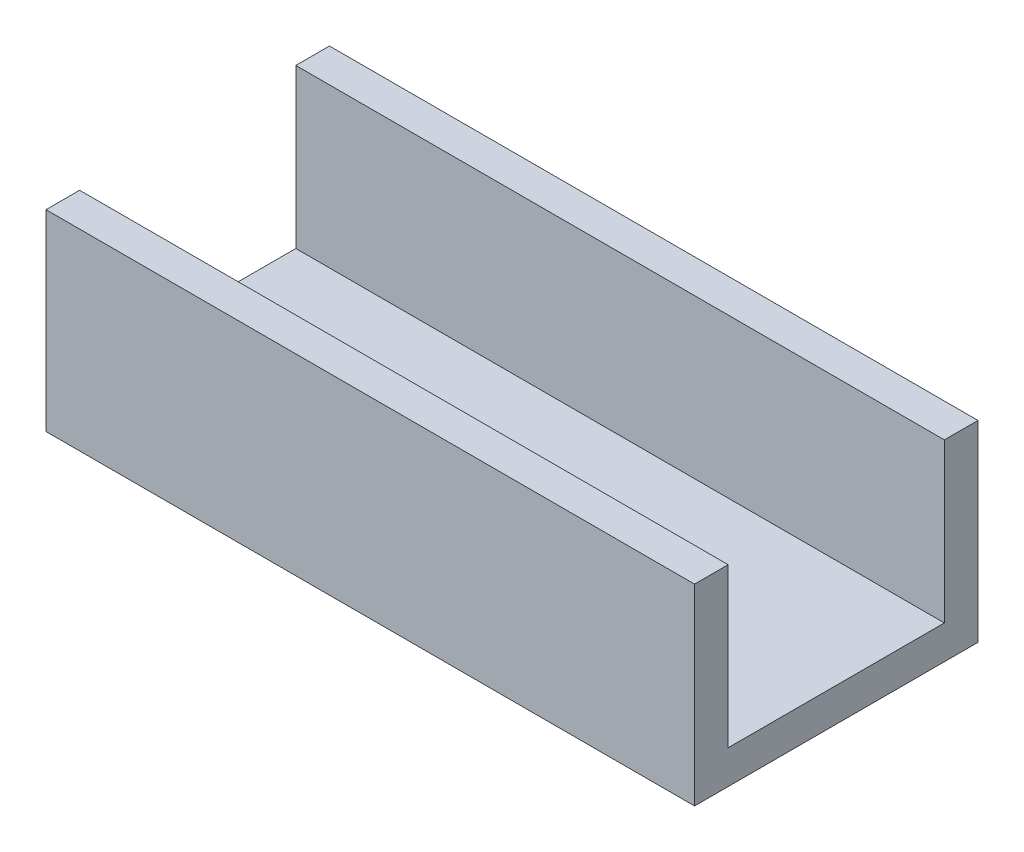
ISO-10303-21;
HEADER;
FILE_DESCRIPTION(('STEP AP214'),'2;1');
FILE_NAME('part.step','',(''),(''),'','','');
FILE_SCHEMA(('AUTOMOTIVE_DESIGN { 1 0 10303 214 1 1 1 1 }'));
ENDSEC;
DATA;
#1=APPLICATION_CONTEXT('core data for automotive mechanical design processes');
#2=APPLICATION_PROTOCOL_DEFINITION('international standard','automotive_design',2000,#1);
#3=PRODUCT_CONTEXT('',#1,'mechanical');
#4=PRODUCT('Part','Part','',(#3));
#5=PRODUCT_RELATED_PRODUCT_CATEGORY('part','',(#4));
#6=PRODUCT_DEFINITION_FORMATION('','',#4);
#7=PRODUCT_DEFINITION_CONTEXT('part definition',#1,'design');
#8=PRODUCT_DEFINITION('design','',#6,#7);
#9=PRODUCT_DEFINITION_SHAPE('','',#8);
#10=(LENGTH_UNIT() NAMED_UNIT(*) SI_UNIT(.MILLI.,.METRE.));
#11=(NAMED_UNIT(*) PLANE_ANGLE_UNIT() SI_UNIT($,.RADIAN.));
#12=(NAMED_UNIT(*) SI_UNIT($,.STERADIAN.) SOLID_ANGLE_UNIT());
#13=UNCERTAINTY_MEASURE_WITH_UNIT(LENGTH_MEASURE(1.E-05),#10,'distance_accuracy_value','');
#14=(GEOMETRIC_REPRESENTATION_CONTEXT(3) GLOBAL_UNCERTAINTY_ASSIGNED_CONTEXT((#13)) GLOBAL_UNIT_ASSIGNED_CONTEXT((#10,
#11,#12)) REPRESENTATION_CONTEXT('',''));
#15=CARTESIAN_POINT('',(0.,0.,0.));
#16=DIRECTION('',(0.,0.,1.));
#17=DIRECTION('',(1.,0.,0.));
#18=AXIS2_PLACEMENT_3D('',#15,#16,#17);
#19=CARTESIAN_POINT('',(0.,1.4,0.));
#20=DIRECTION('',(0.,1.,0.));
#21=DIRECTION('',(0.,0.,1.));
#22=AXIS2_PLACEMENT_3D('',#19,#20,#21);
#23=PLANE('',#22);
#24=DIRECTION('',(0.,0.,-1.));
#25=VECTOR('',#24,1.);
#26=CARTESIAN_POINT('',(0.,1.4,0.));
#27=LINE('',#26,#25);
#28=CARTESIAN_POINT('',(0.,1.4,-1.4));
#29=VERTEX_POINT('',#28);
#30=CARTESIAN_POINT('',(0.,1.4,-10.4));
#31=VERTEX_POINT('',#30);
#32=EDGE_CURVE('E56',#29,#31,#27,.T.);
#33=ORIENTED_EDGE('',*,*,#32,.F.);
#34=DIRECTION('',(1.,0.,0.));
#35=VECTOR('',#34,1.);
#36=CARTESIAN_POINT('',(0.,1.4,-1.4));
#37=LINE('',#36,#35);
#38=CARTESIAN_POINT('',(27.,1.4,-1.4));
#39=VERTEX_POINT('',#38);
#40=EDGE_CURVE('E60',#29,#39,#37,.T.);
#41=ORIENTED_EDGE('',*,*,#40,.T.);
#42=DIRECTION('',(0.,0.,-1.));
#43=VECTOR('',#42,1.);
#44=CARTESIAN_POINT('',(27.,1.4,0.));
#45=LINE('',#44,#43);
#46=CARTESIAN_POINT('',(27.,1.4,-10.4));
#47=VERTEX_POINT('',#46);
#48=EDGE_CURVE('E126',#39,#47,#45,.T.);
#49=ORIENTED_EDGE('',*,*,#48,.T.);
#50=DIRECTION('',(-1.,0.,0.));
#51=VECTOR('',#50,1.);
#52=CARTESIAN_POINT('',(0.,1.4,-10.4));
#53=LINE('',#52,#51);
#54=EDGE_CURVE('E149',#47,#31,#53,.T.);
#55=ORIENTED_EDGE('',*,*,#54,.T.);
#56=EDGE_LOOP('',(#33,#41,#49,#55));
#57=FACE_BOUND('',#56,.T.);
#58=ADVANCED_FACE('F41',(#57),#23,.T.);
#59=CARTESIAN_POINT('',(0.,1.4,0.));
#60=DIRECTION('',(-1.,0.,0.));
#61=DIRECTION('',(0.,0.,1.));
#62=AXIS2_PLACEMENT_3D('',#59,#60,#61);
#63=PLANE('',#62);
#64=DIRECTION('',(0.,-1.,0.));
#65=VECTOR('',#64,1.);
#66=CARTESIAN_POINT('',(0.,1.4,0.));
#67=LINE('',#66,#65);
#68=CARTESIAN_POINT('',(0.,8.,0.));
#69=VERTEX_POINT('',#68);
#70=CARTESIAN_POINT('',(0.,0.,0.));
#71=VERTEX_POINT('',#70);
#72=EDGE_CURVE('E11',#69,#71,#67,.T.);
#73=ORIENTED_EDGE('',*,*,#72,.F.);
#74=DIRECTION('',(0.,0.,-1.));
#75=VECTOR('',#74,1.);
#76=CARTESIAN_POINT('',(0.,8.,0.));
#77=LINE('',#76,#75);
#78=CARTESIAN_POINT('',(0.,8.,-1.4));
#79=VERTEX_POINT('',#78);
#80=EDGE_CURVE('E113',#69,#79,#77,.T.);
#81=ORIENTED_EDGE('',*,*,#80,.T.);
#82=DIRECTION('',(0.,-1.,0.));
#83=VECTOR('',#82,1.);
#84=CARTESIAN_POINT('',(0.,8.,-1.4));
#85=LINE('',#84,#83);
#86=EDGE_CURVE('E109',#79,#29,#85,.T.);
#87=ORIENTED_EDGE('',*,*,#86,.T.);
#88=ORIENTED_EDGE('',*,*,#32,.T.);
#89=DIRECTION('',(0.,-1.,0.));
#90=VECTOR('',#89,1.);
#91=CARTESIAN_POINT('',(0.,8.,-10.4));
#92=LINE('',#91,#90);
#93=CARTESIAN_POINT('',(0.,8.,-10.4));
#94=VERTEX_POINT('',#93);
#95=EDGE_CURVE('E144',#94,#31,#92,.T.);
#96=ORIENTED_EDGE('',*,*,#95,.F.);
#97=DIRECTION('',(0.,0.,-1.));
#98=VECTOR('',#97,1.);
#99=CARTESIAN_POINT('',(0.,8.,0.));
#100=LINE('',#99,#98);
#101=CARTESIAN_POINT('',(0.,8.,-11.8));
#102=VERTEX_POINT('',#101);
#103=EDGE_CURVE('E141',#94,#102,#100,.T.);
#104=ORIENTED_EDGE('',*,*,#103,.T.);
#105=DIRECTION('',(0.,-1.,0.));
#106=VECTOR('',#105,1.);
#107=CARTESIAN_POINT('',(0.,1.4,-11.8));
#108=LINE('',#107,#106);
#109=CARTESIAN_POINT('',(0.,0.,-11.8));
#110=VERTEX_POINT('',#109);
#111=EDGE_CURVE('E155',#102,#110,#108,.T.);
#112=ORIENTED_EDGE('',*,*,#111,.T.);
#113=DIRECTION('',(0.,0.,-1.));
#114=VECTOR('',#113,1.);
#115=CARTESIAN_POINT('',(0.,0.,0.));
#116=LINE('',#115,#114);
#117=EDGE_CURVE('E151',#71,#110,#116,.T.);
#118=ORIENTED_EDGE('',*,*,#117,.F.);
#119=EDGE_LOOP('',(#73,#81,#87,#88,#96,#104,#112,#118));
#120=FACE_BOUND('',#119,.T.);
#121=ADVANCED_FACE('F43',(#120),#63,.T.);
#122=CARTESIAN_POINT('',(0.,1.4,0.));
#123=DIRECTION('',(0.,0.,-1.));
#124=DIRECTION('',(-1.,0.,0.));
#125=AXIS2_PLACEMENT_3D('',#122,#123,#124);
#126=PLANE('',#125);
#127=DIRECTION('',(1.,0.,0.));
#128=VECTOR('',#127,1.);
#129=CARTESIAN_POINT('',(0.,0.,0.));
#130=LINE('',#129,#128);
#131=CARTESIAN_POINT('',(27.,0.,0.));
#132=VERTEX_POINT('',#131);
#133=EDGE_CURVE('E157',#71,#132,#130,.T.);
#134=ORIENTED_EDGE('',*,*,#133,.T.);
#135=DIRECTION('',(0.,-1.,0.));
#136=VECTOR('',#135,1.);
#137=CARTESIAN_POINT('',(27.,1.4,0.));
#138=LINE('',#137,#136);
#139=CARTESIAN_POINT('',(27.,8.,0.));
#140=VERTEX_POINT('',#139);
#141=EDGE_CURVE('E49',#140,#132,#138,.T.);
#142=ORIENTED_EDGE('',*,*,#141,.F.);
#143=DIRECTION('',(1.,0.,0.));
#144=VECTOR('',#143,1.);
#145=CARTESIAN_POINT('',(0.,8.,0.));
#146=LINE('',#145,#144);
#147=EDGE_CURVE('E120',#69,#140,#146,.T.);
#148=ORIENTED_EDGE('',*,*,#147,.F.);
#149=ORIENTED_EDGE('',*,*,#72,.T.);
#150=EDGE_LOOP('',(#134,#142,#148,#149));
#151=FACE_BOUND('',#150,.T.);
#152=ADVANCED_FACE('F190',(#151),#126,.F.);
#153=CARTESIAN_POINT('',(27.,1.4,0.));
#154=DIRECTION('',(-1.,0.,0.));
#155=DIRECTION('',(0.,0.,1.));
#156=AXIS2_PLACEMENT_3D('',#153,#154,#155);
#157=PLANE('',#156);
#158=DIRECTION('',(0.,0.,-1.));
#159=VECTOR('',#158,1.);
#160=CARTESIAN_POINT('',(27.,0.,0.));
#161=LINE('',#160,#159);
#162=CARTESIAN_POINT('',(27.,0.,-11.8));
#163=VERTEX_POINT('',#162);
#164=EDGE_CURVE('E159',#132,#163,#161,.T.);
#165=ORIENTED_EDGE('',*,*,#164,.T.);
#166=DIRECTION('',(0.,-1.,0.));
#167=VECTOR('',#166,1.);
#168=CARTESIAN_POINT('',(27.,1.4,-11.8));
#169=LINE('',#168,#167);
#170=CARTESIAN_POINT('',(27.,8.,-11.8));
#171=VERTEX_POINT('',#170);
#172=EDGE_CURVE('E165',#171,#163,#169,.T.);
#173=ORIENTED_EDGE('',*,*,#172,.F.);
#174=DIRECTION('',(0.,0.,-1.));
#175=VECTOR('',#174,1.);
#176=CARTESIAN_POINT('',(27.,8.,0.));
#177=LINE('',#176,#175);
#178=CARTESIAN_POINT('',(27.,8.,-10.4));
#179=VERTEX_POINT('',#178);
#180=EDGE_CURVE('E135',#179,#171,#177,.T.);
#181=ORIENTED_EDGE('',*,*,#180,.F.);
#182=DIRECTION('',(0.,-1.,0.));
#183=VECTOR('',#182,1.);
#184=CARTESIAN_POINT('',(27.,8.,-10.4));
#185=LINE('',#184,#183);
#186=EDGE_CURVE('E147',#179,#47,#185,.T.);
#187=ORIENTED_EDGE('',*,*,#186,.T.);
#188=ORIENTED_EDGE('',*,*,#48,.F.);
#189=DIRECTION('',(0.,-1.,0.));
#190=VECTOR('',#189,1.);
#191=CARTESIAN_POINT('',(27.,8.,-1.4));
#192=LINE('',#191,#190);
#193=CARTESIAN_POINT('',(27.,8.,-1.4));
#194=VERTEX_POINT('',#193);
#195=EDGE_CURVE('E107',#194,#39,#192,.T.);
#196=ORIENTED_EDGE('',*,*,#195,.F.);
#197=DIRECTION('',(0.,0.,-1.));
#198=VECTOR('',#197,1.);
#199=CARTESIAN_POINT('',(27.,8.,0.));
#200=LINE('',#199,#198);
#201=EDGE_CURVE('E114',#140,#194,#200,.T.);
#202=ORIENTED_EDGE('',*,*,#201,.F.);
#203=ORIENTED_EDGE('',*,*,#141,.T.);
#204=EDGE_LOOP('',(#165,#173,#181,#187,#188,#196,#202,#203));
#205=FACE_BOUND('',#204,.T.);
#206=ADVANCED_FACE('F124',(#205),#157,.F.);
#207=CARTESIAN_POINT('',(0.,1.4,-11.8));
#208=DIRECTION('',(0.,0.,-1.));
#209=DIRECTION('',(-1.,0.,0.));
#210=AXIS2_PLACEMENT_3D('',#207,#208,#209);
#211=PLANE('',#210);
#212=DIRECTION('',(1.,0.,0.));
#213=VECTOR('',#212,1.);
#214=CARTESIAN_POINT('',(0.,0.,-11.8));
#215=LINE('',#214,#213);
#216=EDGE_CURVE('E153',#110,#163,#215,.T.);
#217=ORIENTED_EDGE('',*,*,#216,.F.);
#218=ORIENTED_EDGE('',*,*,#111,.F.);
#219=DIRECTION('',(1.,0.,0.));
#220=VECTOR('',#219,1.);
#221=CARTESIAN_POINT('',(0.,8.,-11.8));
#222=LINE('',#221,#220);
#223=EDGE_CURVE('E138',#102,#171,#222,.T.);
#224=ORIENTED_EDGE('',*,*,#223,.T.);
#225=ORIENTED_EDGE('',*,*,#172,.T.);
#226=EDGE_LOOP('',(#217,#218,#224,#225));
#227=FACE_BOUND('',#226,.T.);
#228=ADVANCED_FACE('F175',(#227),#211,.T.);
#229=CARTESIAN_POINT('',(0.,0.,0.));
#230=DIRECTION('',(0.,1.,0.));
#231=DIRECTION('',(0.,0.,1.));
#232=AXIS2_PLACEMENT_3D('',#229,#230,#231);
#233=PLANE('',#232);
#234=ORIENTED_EDGE('',*,*,#117,.T.);
#235=ORIENTED_EDGE('',*,*,#216,.T.);
#236=ORIENTED_EDGE('',*,*,#164,.F.);
#237=ORIENTED_EDGE('',*,*,#133,.F.);
#238=EDGE_LOOP('',(#234,#235,#236,#237));
#239=FACE_BOUND('',#238,.T.);
#240=ADVANCED_FACE('F171',(#239),#233,.F.);
#241=CARTESIAN_POINT('',(0.,8.,-10.4));
#242=DIRECTION('',(0.,0.,-1.));
#243=DIRECTION('',(-1.,0.,0.));
#244=AXIS2_PLACEMENT_3D('',#241,#242,#243);
#245=PLANE('',#244);
#246=ORIENTED_EDGE('',*,*,#54,.F.);
#247=ORIENTED_EDGE('',*,*,#186,.F.);
#248=DIRECTION('',(1.,0.,0.));
#249=VECTOR('',#248,1.);
#250=CARTESIAN_POINT('',(0.,8.,-10.4));
#251=LINE('',#250,#249);
#252=EDGE_CURVE('E128',#94,#179,#251,.T.);
#253=ORIENTED_EDGE('',*,*,#252,.F.);
#254=ORIENTED_EDGE('',*,*,#95,.T.);
#255=EDGE_LOOP('',(#246,#247,#253,#254));
#256=FACE_BOUND('',#255,.T.);
#257=ADVANCED_FACE('F184',(#256),#245,.F.);
#258=CARTESIAN_POINT('',(0.,8.,0.));
#259=DIRECTION('',(0.,1.,0.));
#260=DIRECTION('',(0.,0.,1.));
#261=AXIS2_PLACEMENT_3D('',#258,#259,#260);
#262=PLANE('',#261);
#263=ORIENTED_EDGE('',*,*,#252,.T.);
#264=ORIENTED_EDGE('',*,*,#180,.T.);
#265=ORIENTED_EDGE('',*,*,#223,.F.);
#266=ORIENTED_EDGE('',*,*,#103,.F.);
#267=EDGE_LOOP('',(#263,#264,#265,#266));
#268=FACE_BOUND('',#267,.T.);
#269=ADVANCED_FACE('F178',(#268),#262,.T.);
#270=CARTESIAN_POINT('',(0.,8.,-1.4));
#271=DIRECTION('',(0.,0.,1.));
#272=DIRECTION('',(1.,0.,0.));
#273=AXIS2_PLACEMENT_3D('',#270,#271,#272);
#274=PLANE('',#273);
#275=ORIENTED_EDGE('',*,*,#40,.F.);
#276=ORIENTED_EDGE('',*,*,#86,.F.);
#277=DIRECTION('',(-1.,0.,0.));
#278=VECTOR('',#277,1.);
#279=CARTESIAN_POINT('',(0.,8.,-1.4));
#280=LINE('',#279,#278);
#281=EDGE_CURVE('E103',#194,#79,#280,.T.);
#282=ORIENTED_EDGE('',*,*,#281,.F.);
#283=ORIENTED_EDGE('',*,*,#195,.T.);
#284=EDGE_LOOP('',(#275,#276,#282,#283));
#285=FACE_BOUND('',#284,.T.);
#286=ADVANCED_FACE('F105',(#285),#274,.F.);
#287=CARTESIAN_POINT('',(0.,8.,0.));
#288=DIRECTION('',(0.,1.,0.));
#289=DIRECTION('',(0.,0.,1.));
#290=AXIS2_PLACEMENT_3D('',#287,#288,#289);
#291=PLANE('',#290);
#292=ORIENTED_EDGE('',*,*,#201,.T.);
#293=ORIENTED_EDGE('',*,*,#281,.T.);
#294=ORIENTED_EDGE('',*,*,#80,.F.);
#295=ORIENTED_EDGE('',*,*,#147,.T.);
#296=EDGE_LOOP('',(#292,#293,#294,#295));
#297=FACE_BOUND('',#296,.T.);
#298=ADVANCED_FACE('F118',(#297),#291,.T.);
#299=CLOSED_SHELL('',(#58,#121,#152,#206,#228,#240,#257,#269,#286,#298));
#300=MANIFOLD_SOLID_BREP('B2',#299);
#301=ADVANCED_BREP_SHAPE_REPRESENTATION('',(#18,#300),#14);
#302=SHAPE_DEFINITION_REPRESENTATION(#9,#301);
ENDSEC;
END-ISO-10303-21;
